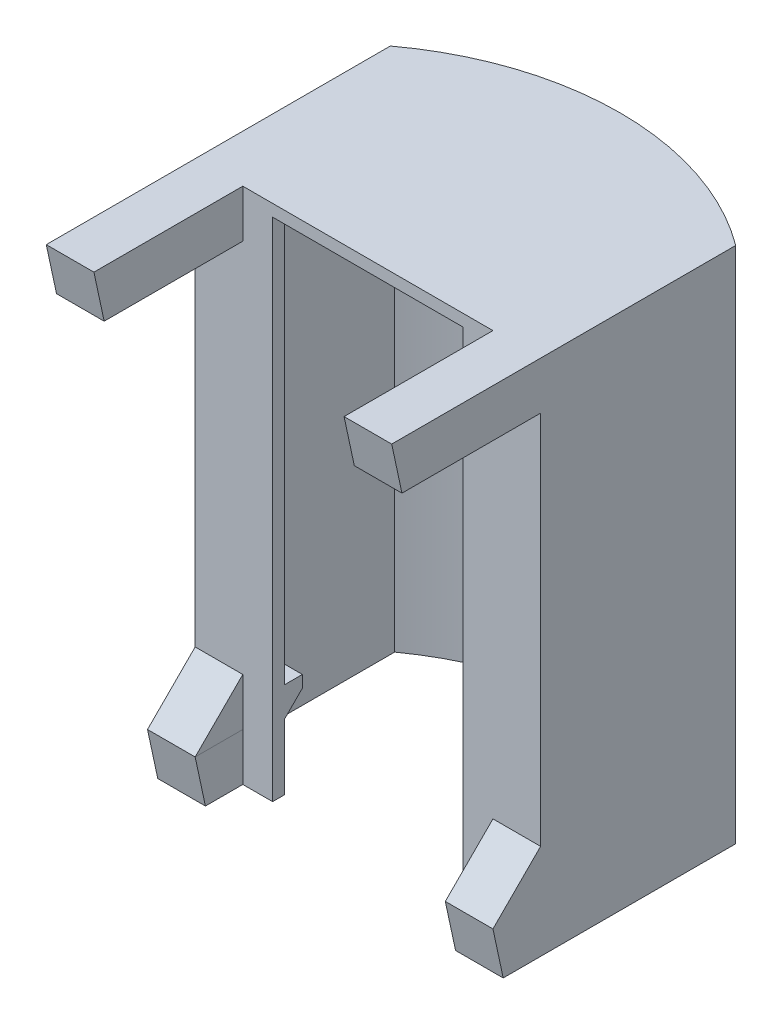
ISO-10303-21;
HEADER;
FILE_DESCRIPTION(('STEP AP214'),'2;1');
FILE_NAME('part.step','',(''),(''),'','','');
FILE_SCHEMA(('AUTOMOTIVE_DESIGN { 1 0 10303 214 1 1 1 1 }'));
ENDSEC;
DATA;
#1=APPLICATION_CONTEXT('core data for automotive mechanical design processes');
#2=APPLICATION_PROTOCOL_DEFINITION('international standard','automotive_design',2000,#1);
#3=PRODUCT_CONTEXT('',#1,'mechanical');
#4=PRODUCT('Part','Part','',(#3));
#5=PRODUCT_RELATED_PRODUCT_CATEGORY('part','',(#4));
#6=PRODUCT_DEFINITION_FORMATION('','',#4);
#7=PRODUCT_DEFINITION_CONTEXT('part definition',#1,'design');
#8=PRODUCT_DEFINITION('design','',#6,#7);
#9=PRODUCT_DEFINITION_SHAPE('','',#8);
#10=(LENGTH_UNIT() NAMED_UNIT(*) SI_UNIT(.MILLI.,.METRE.));
#11=(NAMED_UNIT(*) PLANE_ANGLE_UNIT() SI_UNIT($,.RADIAN.));
#12=(NAMED_UNIT(*) SI_UNIT($,.STERADIAN.) SOLID_ANGLE_UNIT());
#13=UNCERTAINTY_MEASURE_WITH_UNIT(LENGTH_MEASURE(1.E-05),#10,'distance_accuracy_value','');
#14=(GEOMETRIC_REPRESENTATION_CONTEXT(3) GLOBAL_UNCERTAINTY_ASSIGNED_CONTEXT((#13)) GLOBAL_UNIT_ASSIGNED_CONTEXT((#10,
#11,#12)) REPRESENTATION_CONTEXT('',''));
#15=CARTESIAN_POINT('',(0.,0.,0.));
#16=DIRECTION('',(0.,0.,1.));
#17=DIRECTION('',(1.,0.,0.));
#18=AXIS2_PLACEMENT_3D('',#15,#16,#17);
#19=CARTESIAN_POINT('',(-21.,7.99999999999999,17.));
#20=DIRECTION('',(0.,-1.,0.));
#21=DIRECTION('',(0.,0.,-1.));
#22=AXIS2_PLACEMENT_3D('',#19,#20,#21);
#23=PLANE('',#22);
#24=DIRECTION('',(0.,0.,1.));
#25=VECTOR('',#24,1.);
#26=CARTESIAN_POINT('',(-29.,7.99999999999999,17.));
#27=LINE('',#26,#25);
#28=CARTESIAN_POINT('',(-29.,7.99999999999999,17.));
#29=VERTEX_POINT('',#28);
#30=CARTESIAN_POINT('',(-29.,8.,25.));
#31=VERTEX_POINT('',#30);
#32=EDGE_CURVE('E95',#29,#31,#27,.T.);
#33=ORIENTED_EDGE('',*,*,#32,.F.);
#34=DIRECTION('',(-1.,0.,0.));
#35=VECTOR('',#34,1.);
#36=CARTESIAN_POINT('',(-21.,7.99999999999999,17.));
#37=LINE('',#36,#35);
#38=CARTESIAN_POINT('',(-21.,7.99999999999999,17.));
#39=VERTEX_POINT('',#38);
#40=EDGE_CURVE('E12',#39,#29,#37,.T.);
#41=ORIENTED_EDGE('',*,*,#40,.F.);
#42=DIRECTION('',(0.,0.,1.));
#43=VECTOR('',#42,1.);
#44=CARTESIAN_POINT('',(-21.,7.99999999999999,17.));
#45=LINE('',#44,#43);
#46=CARTESIAN_POINT('',(-21.,8.,25.));
#47=VERTEX_POINT('',#46);
#48=EDGE_CURVE('E87',#39,#47,#45,.T.);
#49=ORIENTED_EDGE('',*,*,#48,.T.);
#50=DIRECTION('',(-1.,0.,0.));
#51=VECTOR('',#50,1.);
#52=CARTESIAN_POINT('',(-21.,8.,25.));
#53=LINE('',#52,#51);
#54=EDGE_CURVE('E46',#47,#31,#53,.T.);
#55=ORIENTED_EDGE('',*,*,#54,.T.);
#56=EDGE_LOOP('',(#33,#41,#49,#55));
#57=FACE_BOUND('',#56,.T.);
#58=ADVANCED_FACE('F43',(#57),#23,.T.);
#59=CARTESIAN_POINT('',(-21.,16.0000000000001,17.));
#60=DIRECTION('',(0.,0.,-1.));
#61=DIRECTION('',(-1.,0.,0.));
#62=AXIS2_PLACEMENT_3D('',#59,#60,#61);
#63=PLANE('',#62);
#64=DIRECTION('',(0.,-1.,0.));
#65=VECTOR('',#64,1.);
#66=CARTESIAN_POINT('',(-29.,16.0000000000001,17.));
#67=LINE('',#66,#65);
#68=CARTESIAN_POINT('',(-29.,16.0000000000001,17.));
#69=VERTEX_POINT('',#68);
#70=EDGE_CURVE('E89',#69,#29,#67,.T.);
#71=ORIENTED_EDGE('',*,*,#70,.F.);
#72=DIRECTION('',(-1.,0.,0.));
#73=VECTOR('',#72,1.);
#74=CARTESIAN_POINT('',(-21.,16.0000000000001,17.));
#75=LINE('',#74,#73);
#76=CARTESIAN_POINT('',(-21.,16.0000000000001,17.));
#77=VERTEX_POINT('',#76);
#78=EDGE_CURVE('E52',#77,#69,#75,.T.);
#79=ORIENTED_EDGE('',*,*,#78,.F.);
#80=DIRECTION('',(0.,-1.,0.));
#81=VECTOR('',#80,1.);
#82=CARTESIAN_POINT('',(-21.,16.0000000000001,17.));
#83=LINE('',#82,#81);
#84=EDGE_CURVE('E84',#77,#39,#83,.T.);
#85=ORIENTED_EDGE('',*,*,#84,.T.);
#86=ORIENTED_EDGE('',*,*,#40,.T.);
#87=EDGE_LOOP('',(#71,#79,#85,#86));
#88=FACE_BOUND('',#87,.T.);
#89=ADVANCED_FACE('F99',(#88),#63,.T.);
#90=CARTESIAN_POINT('',(-21.,8.,25.));
#91=DIRECTION('',(0.,0.707106781186543,0.707106781186552));
#92=DIRECTION('',(0.,-0.707106781186552,0.707106781186543));
#93=AXIS2_PLACEMENT_3D('',#90,#91,#92);
#94=PLANE('',#93);
#95=DIRECTION('',(0.,0.707106781186552,-0.707106781186543));
#96=VECTOR('',#95,1.);
#97=CARTESIAN_POINT('',(-29.,8.,25.));
#98=LINE('',#97,#96);
#99=EDGE_CURVE('E82',#31,#69,#98,.T.);
#100=ORIENTED_EDGE('',*,*,#99,.F.);
#101=ORIENTED_EDGE('',*,*,#54,.F.);
#102=DIRECTION('',(0.,0.707106781186552,-0.707106781186543));
#103=VECTOR('',#102,1.);
#104=CARTESIAN_POINT('',(-21.,8.,25.));
#105=LINE('',#104,#103);
#106=EDGE_CURVE('E80',#47,#77,#105,.T.);
#107=ORIENTED_EDGE('',*,*,#106,.T.);
#108=ORIENTED_EDGE('',*,*,#78,.T.);
#109=EDGE_LOOP('',(#100,#101,#107,#108));
#110=FACE_BOUND('',#109,.T.);
#111=ADVANCED_FACE('F79',(#110),#94,.T.);
#112=CARTESIAN_POINT('',(-21.,0.,0.));
#113=DIRECTION('',(1.,0.,0.));
#114=DIRECTION('',(0.,0.,-1.));
#115=AXIS2_PLACEMENT_3D('',#112,#113,#114);
#116=PLANE('',#115);
#117=ORIENTED_EDGE('',*,*,#48,.F.);
#118=ORIENTED_EDGE('',*,*,#84,.F.);
#119=ORIENTED_EDGE('',*,*,#106,.F.);
#120=EDGE_LOOP('',(#117,#118,#119));
#121=FACE_BOUND('',#120,.T.);
#122=ADVANCED_FACE('F86',(#121),#116,.T.);
#123=CARTESIAN_POINT('',(-29.,0.,0.));
#124=DIRECTION('',(1.,0.,0.));
#125=DIRECTION('',(0.,0.,-1.));
#126=AXIS2_PLACEMENT_3D('',#123,#124,#125);
#127=PLANE('',#126);
#128=ORIENTED_EDGE('',*,*,#32,.T.);
#129=ORIENTED_EDGE('',*,*,#99,.T.);
#130=ORIENTED_EDGE('',*,*,#70,.T.);
#131=EDGE_LOOP('',(#128,#129,#130));
#132=FACE_BOUND('',#131,.T.);
#133=ADVANCED_FACE('F98',(#132),#127,.F.);
#134=CLOSED_SHELL('',(#58,#89,#111,#122,#133));
#135=MANIFOLD_SOLID_BREP('B2',#134);
#136=CARTESIAN_POINT('',(-27.5,85.,15.));
#137=DIRECTION('',(0.,0.,1.));
#138=DIRECTION('',(1.,0.,0.));
#139=AXIS2_PLACEMENT_3D('',#136,#137,#138);
#140=PLANE('',#139);
#141=DIRECTION('',(1.,0.,0.));
#142=VECTOR('',#141,1.);
#143=CARTESIAN_POINT('',(-27.5,16.,15.));
#144=LINE('',#143,#142);
#145=CARTESIAN_POINT('',(-27.5,16.,15.));
#146=VERTEX_POINT('',#145);
#147=CARTESIAN_POINT('',(-16.,16.,15.));
#148=VERTEX_POINT('',#147);
#149=EDGE_CURVE('E367',#146,#148,#144,.T.);
#150=ORIENTED_EDGE('',*,*,#149,.F.);
#151=DIRECTION('',(0.,-1.,0.));
#152=VECTOR('',#151,1.);
#153=CARTESIAN_POINT('',(-27.5,85.,15.));
#154=LINE('',#153,#152);
#155=CARTESIAN_POINT('',(-27.5,85.,15.));
#156=VERTEX_POINT('',#155);
#157=EDGE_CURVE('E372',#156,#146,#154,.T.);
#158=ORIENTED_EDGE('',*,*,#157,.F.);
#159=DIRECTION('',(-1.,0.,0.));
#160=VECTOR('',#159,1.);
#161=CARTESIAN_POINT('',(-27.5,85.,15.));
#162=LINE('',#161,#160);
#163=CARTESIAN_POINT('',(-16.,85.,15.));
#164=VERTEX_POINT('',#163);
#165=EDGE_CURVE('E515',#164,#156,#162,.T.);
#166=ORIENTED_EDGE('',*,*,#165,.F.);
#167=DIRECTION('',(0.,-1.,0.));
#168=VECTOR('',#167,1.);
#169=CARTESIAN_POINT('',(-16.,85.,15.));
#170=LINE('',#169,#168);
#171=EDGE_CURVE('E558',#164,#148,#170,.T.);
#172=ORIENTED_EDGE('',*,*,#171,.T.);
#173=EDGE_LOOP('',(#150,#158,#166,#172));
#174=FACE_BOUND('',#173,.T.);
#175=ADVANCED_FACE('F141',(#174),#140,.F.);
#176=CARTESIAN_POINT('',(-27.5,11.,15.));
#177=VERTEX_POINT('',#176);
#178=CARTESIAN_POINT('',(-27.5,0.,15.));
#179=VERTEX_POINT('',#178);
#180=EDGE_CURVE('E555',#177,#179,#154,.T.);
#181=ORIENTED_EDGE('',*,*,#180,.F.);
#182=DIRECTION('',(1.,0.,0.));
#183=VECTOR('',#182,1.);
#184=CARTESIAN_POINT('',(-16.,11.,15.));
#185=LINE('',#184,#183);
#186=CARTESIAN_POINT('',(-16.,11.,15.));
#187=VERTEX_POINT('',#186);
#188=EDGE_CURVE('E591',#177,#187,#185,.T.);
#189=ORIENTED_EDGE('',*,*,#188,.T.);
#190=CARTESIAN_POINT('',(-16.,0.,15.));
#191=VERTEX_POINT('',#190);
#192=EDGE_CURVE('E557',#187,#191,#170,.T.);
#193=ORIENTED_EDGE('',*,*,#192,.T.);
#194=DIRECTION('',(-1.,0.,0.));
#195=VECTOR('',#194,1.);
#196=CARTESIAN_POINT('',(-27.5,0.,15.));
#197=LINE('',#196,#195);
#198=EDGE_CURVE('E549',#191,#179,#197,.T.);
#199=ORIENTED_EDGE('',*,*,#198,.T.);
#200=EDGE_LOOP('',(#181,#189,#193,#199));
#201=FACE_BOUND('',#200,.T.);
#202=ADVANCED_FACE('F623',(#201),#140,.F.);
#203=CARTESIAN_POINT('',(-27.5,85.,15.));
#204=DIRECTION('',(-1.,0.,0.));
#205=DIRECTION('',(0.,0.,1.));
#206=AXIS2_PLACEMENT_3D('',#203,#204,#205);
#207=PLANE('',#206);
#208=DIRECTION('',(0.,1.,0.));
#209=VECTOR('',#208,1.);
#210=CARTESIAN_POINT('',(-27.5,14.,12.));
#211=LINE('',#210,#209);
#212=CARTESIAN_POINT('',(-27.5,14.,12.));
#213=VERTEX_POINT('',#212);
#214=CARTESIAN_POINT('',(-27.5,16.,12.));
#215=VERTEX_POINT('',#214);
#216=EDGE_CURVE('E359',#213,#215,#211,.T.);
#217=ORIENTED_EDGE('',*,*,#216,.F.);
#218=DIRECTION('',(0.,0.707106781186544,-0.707106781186551));
#219=VECTOR('',#218,1.);
#220=CARTESIAN_POINT('',(-27.5,14.,12.));
#221=LINE('',#220,#219);
#222=EDGE_CURVE('E589',#213,#177,#221,.F.);
#223=ORIENTED_EDGE('',*,*,#222,.T.);
#224=ORIENTED_EDGE('',*,*,#180,.T.);
#225=DIRECTION('',(0.,0.,-1.));
#226=VECTOR('',#225,1.);
#227=CARTESIAN_POINT('',(-27.5,0.,15.));
#228=LINE('',#227,#226);
#229=CARTESIAN_POINT('',(-27.5,0.,-15.));
#230=VERTEX_POINT('',#229);
#231=EDGE_CURVE('E503',#179,#230,#228,.T.);
#232=ORIENTED_EDGE('',*,*,#231,.T.);
#233=DIRECTION('',(0.,-1.,0.));
#234=VECTOR('',#233,1.);
#235=CARTESIAN_POINT('',(-27.5,85.,-15.));
#236=LINE('',#235,#234);
#237=CARTESIAN_POINT('',(-27.5,85.,-15.));
#238=VERTEX_POINT('',#237);
#239=EDGE_CURVE('E521',#238,#230,#236,.T.);
#240=ORIENTED_EDGE('',*,*,#239,.F.);
#241=DIRECTION('',(0.,0.,-1.));
#242=VECTOR('',#241,1.);
#243=CARTESIAN_POINT('',(-27.5,85.,15.));
#244=LINE('',#243,#242);
#245=EDGE_CURVE('E518',#156,#238,#244,.T.);
#246=ORIENTED_EDGE('',*,*,#245,.F.);
#247=ORIENTED_EDGE('',*,*,#157,.T.);
#248=DIRECTION('',(0.,0.,1.));
#249=VECTOR('',#248,1.);
#250=CARTESIAN_POINT('',(-27.5,16.,12.));
#251=LINE('',#250,#249);
#252=EDGE_CURVE('E351',#215,#146,#251,.T.);
#253=ORIENTED_EDGE('',*,*,#252,.F.);
#254=EDGE_LOOP('',(#217,#223,#224,#232,#240,#246,#247,#253));
#255=FACE_BOUND('',#254,.T.);
#256=ADVANCED_FACE('F370',(#255),#207,.F.);
#257=CARTESIAN_POINT('',(27.5,85.,15.));
#258=DIRECTION('',(1.,0.,0.));
#259=DIRECTION('',(0.,0.,-1.));
#260=AXIS2_PLACEMENT_3D('',#257,#258,#259);
#261=PLANE('',#260);
#262=DIRECTION('',(0.,-1.,0.));
#263=VECTOR('',#262,1.);
#264=CARTESIAN_POINT('',(27.5,85.,15.));
#265=LINE('',#264,#263);
#266=CARTESIAN_POINT('',(27.5,11.,15.));
#267=VERTEX_POINT('',#266);
#268=CARTESIAN_POINT('',(27.5,0.,15.));
#269=VERTEX_POINT('',#268);
#270=EDGE_CURVE('E582',#267,#269,#265,.T.);
#271=ORIENTED_EDGE('',*,*,#270,.F.);
#272=DIRECTION('',(0.,-0.707106781186545,0.707106781186551));
#273=VECTOR('',#272,1.);
#274=CARTESIAN_POINT('',(27.5,14.,12.));
#275=LINE('',#274,#273);
#276=CARTESIAN_POINT('',(27.5,14.,12.));
#277=VERTEX_POINT('',#276);
#278=EDGE_CURVE('E594',#267,#277,#275,.F.);
#279=ORIENTED_EDGE('',*,*,#278,.T.);
#280=DIRECTION('',(0.,-1.,0.));
#281=VECTOR('',#280,1.);
#282=CARTESIAN_POINT('',(27.5,14.,12.));
#283=LINE('',#282,#281);
#284=CARTESIAN_POINT('',(27.5,16.,12.));
#285=VERTEX_POINT('',#284);
#286=EDGE_CURVE('E375',#285,#277,#283,.T.);
#287=ORIENTED_EDGE('',*,*,#286,.F.);
#288=DIRECTION('',(0.,0.,1.));
#289=VECTOR('',#288,1.);
#290=CARTESIAN_POINT('',(27.5,16.,12.));
#291=LINE('',#290,#289);
#292=CARTESIAN_POINT('',(27.5,16.,15.));
#293=VERTEX_POINT('',#292);
#294=EDGE_CURVE('E388',#285,#293,#291,.T.);
#295=ORIENTED_EDGE('',*,*,#294,.T.);
#296=CARTESIAN_POINT('',(27.5,85.,15.));
#297=VERTEX_POINT('',#296);
#298=EDGE_CURVE('E583',#297,#293,#265,.T.);
#299=ORIENTED_EDGE('',*,*,#298,.F.);
#300=DIRECTION('',(0.,0.,1.));
#301=VECTOR('',#300,1.);
#302=CARTESIAN_POINT('',(27.5,85.,15.));
#303=LINE('',#302,#301);
#304=CARTESIAN_POINT('',(27.5,85.,-15.));
#305=VERTEX_POINT('',#304);
#306=EDGE_CURVE('E502',#305,#297,#303,.T.);
#307=ORIENTED_EDGE('',*,*,#306,.F.);
#308=DIRECTION('',(0.,-1.,0.));
#309=VECTOR('',#308,1.);
#310=CARTESIAN_POINT('',(27.5,85.,-15.));
#311=LINE('',#310,#309);
#312=CARTESIAN_POINT('',(27.5,0.,-15.));
#313=VERTEX_POINT('',#312);
#314=EDGE_CURVE('E586',#305,#313,#311,.T.);
#315=ORIENTED_EDGE('',*,*,#314,.T.);
#316=DIRECTION('',(0.,0.,1.));
#317=VECTOR('',#316,1.);
#318=CARTESIAN_POINT('',(27.5,0.,15.));
#319=LINE('',#318,#317);
#320=EDGE_CURVE('E524',#313,#269,#319,.T.);
#321=ORIENTED_EDGE('',*,*,#320,.T.);
#322=EDGE_LOOP('',(#271,#279,#287,#295,#299,#307,#315,#321));
#323=FACE_BOUND('',#322,.T.);
#324=ADVANCED_FACE('F631',(#323),#261,.F.);
#325=CARTESIAN_POINT('',(16.,85.,15.));
#326=DIRECTION('',(0.,0.,1.));
#327=DIRECTION('',(1.,0.,0.));
#328=AXIS2_PLACEMENT_3D('',#325,#326,#327);
#329=PLANE('',#328);
#330=DIRECTION('',(0.,-1.,0.));
#331=VECTOR('',#330,1.);
#332=CARTESIAN_POINT('',(16.,85.,15.));
#333=LINE('',#332,#331);
#334=CARTESIAN_POINT('',(16.,11.,15.));
#335=VERTEX_POINT('',#334);
#336=CARTESIAN_POINT('',(16.,0.,15.));
#337=VERTEX_POINT('',#336);
#338=EDGE_CURVE('E578',#335,#337,#333,.T.);
#339=ORIENTED_EDGE('',*,*,#338,.F.);
#340=DIRECTION('',(1.,0.,0.));
#341=VECTOR('',#340,1.);
#342=CARTESIAN_POINT('',(27.5,11.,15.));
#343=LINE('',#342,#341);
#344=EDGE_CURVE('E161',#335,#267,#343,.T.);
#345=ORIENTED_EDGE('',*,*,#344,.T.);
#346=ORIENTED_EDGE('',*,*,#270,.T.);
#347=DIRECTION('',(-1.,0.,0.));
#348=VECTOR('',#347,1.);
#349=CARTESIAN_POINT('',(16.,0.,15.));
#350=LINE('',#349,#348);
#351=EDGE_CURVE('E527',#269,#337,#350,.T.);
#352=ORIENTED_EDGE('',*,*,#351,.T.);
#353=EDGE_LOOP('',(#339,#345,#346,#352));
#354=FACE_BOUND('',#353,.T.);
#355=ADVANCED_FACE('F728',(#354),#329,.F.);
#356=DIRECTION('',(1.,0.,0.));
#357=VECTOR('',#356,1.);
#358=CARTESIAN_POINT('',(27.5,16.,15.));
#359=LINE('',#358,#357);
#360=CARTESIAN_POINT('',(16.,16.,15.));
#361=VERTEX_POINT('',#360);
#362=EDGE_CURVE('E373',#361,#293,#359,.T.);
#363=ORIENTED_EDGE('',*,*,#362,.F.);
#364=CARTESIAN_POINT('',(16.,85.,15.));
#365=VERTEX_POINT('',#364);
#366=EDGE_CURVE('E579',#365,#361,#333,.T.);
#367=ORIENTED_EDGE('',*,*,#366,.F.);
#368=DIRECTION('',(-1.,0.,0.));
#369=VECTOR('',#368,1.);
#370=CARTESIAN_POINT('',(16.,85.,15.));
#371=LINE('',#370,#369);
#372=EDGE_CURVE('E506',#297,#365,#371,.T.);
#373=ORIENTED_EDGE('',*,*,#372,.F.);
#374=ORIENTED_EDGE('',*,*,#298,.T.);
#375=EDGE_LOOP('',(#363,#367,#373,#374));
#376=FACE_BOUND('',#375,.T.);
#377=ADVANCED_FACE('F636',(#376),#329,.F.);
#378=CARTESIAN_POINT('',(-27.5,85.,17.));
#379=DIRECTION('',(0.,0.,-1.));
#380=DIRECTION('',(-1.,0.,0.));
#381=AXIS2_PLACEMENT_3D('',#378,#379,#380);
#382=PLANE('',#381);
#383=DIRECTION('',(0.,-1.,0.));
#384=VECTOR('',#383,1.);
#385=CARTESIAN_POINT('',(21.,0.,17.));
#386=LINE('',#385,#384);
#387=CARTESIAN_POINT('',(21.,15.9999999999999,17.));
#388=VERTEX_POINT('',#387);
#389=CARTESIAN_POINT('',(21.,0.,17.));
#390=VERTEX_POINT('',#389);
#391=EDGE_CURVE('E430',#388,#390,#386,.T.);
#392=ORIENTED_EDGE('',*,*,#391,.F.);
#393=DIRECTION('',(1.,0.,0.));
#394=VECTOR('',#393,1.);
#395=CARTESIAN_POINT('',(21.,15.9999999999999,17.));
#396=LINE('',#395,#394);
#397=CARTESIAN_POINT('',(29.,15.9999999999999,17.));
#398=VERTEX_POINT('',#397);
#399=EDGE_CURVE('E397',#388,#398,#396,.T.);
#400=ORIENTED_EDGE('',*,*,#399,.T.);
#401=DIRECTION('',(0.,-1.,0.));
#402=VECTOR('',#401,1.);
#403=CARTESIAN_POINT('',(29.,85.,17.));
#404=LINE('',#403,#402);
#405=CARTESIAN_POINT('',(29.,79.,17.));
#406=VERTEX_POINT('',#405);
#407=EDGE_CURVE('E572',#406,#398,#404,.T.);
#408=ORIENTED_EDGE('',*,*,#407,.F.);
#409=DIRECTION('',(1.,0.,0.));
#410=VECTOR('',#409,1.);
#411=CARTESIAN_POINT('',(29.,79.,17.));
#412=LINE('',#411,#410);
#413=CARTESIAN_POINT('',(21.,79.,17.));
#414=VERTEX_POINT('',#413);
#415=EDGE_CURVE('E458',#414,#406,#412,.T.);
#416=ORIENTED_EDGE('',*,*,#415,.F.);
#417=DIRECTION('',(0.,-1.,0.));
#418=VECTOR('',#417,1.);
#419=CARTESIAN_POINT('',(21.,87.,17.));
#420=LINE('',#419,#418);
#421=CARTESIAN_POINT('',(21.,87.,17.));
#422=VERTEX_POINT('',#421);
#423=EDGE_CURVE('E454',#422,#414,#420,.T.);
#424=ORIENTED_EDGE('',*,*,#423,.F.);
#425=DIRECTION('',(1.,0.,0.));
#426=VECTOR('',#425,1.);
#427=CARTESIAN_POINT('',(16.,87.,17.));
#428=LINE('',#427,#426);
#429=CARTESIAN_POINT('',(-21.,87.,17.));
#430=VERTEX_POINT('',#429);
#431=EDGE_CURVE('E484',#430,#422,#428,.T.);
#432=ORIENTED_EDGE('',*,*,#431,.F.);
#433=DIRECTION('',(0.,1.,0.));
#434=VECTOR('',#433,1.);
#435=CARTESIAN_POINT('',(-21.,87.,17.));
#436=LINE('',#435,#434);
#437=CARTESIAN_POINT('',(-21.,79.,17.));
#438=VERTEX_POINT('',#437);
#439=EDGE_CURVE('E472',#438,#430,#436,.T.);
#440=ORIENTED_EDGE('',*,*,#439,.F.);
#441=DIRECTION('',(1.,0.,0.));
#442=VECTOR('',#441,1.);
#443=CARTESIAN_POINT('',(-29.,79.,17.));
#444=LINE('',#443,#442);
#445=CARTESIAN_POINT('',(-29.,79.,17.));
#446=VERTEX_POINT('',#445);
#447=EDGE_CURVE('E468',#446,#438,#444,.T.);
#448=ORIENTED_EDGE('',*,*,#447,.F.);
#449=DIRECTION('',(0.,-1.,0.));
#450=VECTOR('',#449,1.);
#451=CARTESIAN_POINT('',(-29.,85.,17.));
#452=LINE('',#451,#450);
#453=CARTESIAN_POINT('',(-29.,7.99999999999999,17.));
#454=VERTEX_POINT('',#453);
#455=EDGE_CURVE('E564',#446,#454,#452,.T.);
#456=ORIENTED_EDGE('',*,*,#455,.T.);
#457=DIRECTION('',(-1.,0.,0.));
#458=VECTOR('',#457,1.);
#459=CARTESIAN_POINT('',(-29.,8.,17.));
#460=LINE('',#459,#458);
#461=CARTESIAN_POINT('',(-21.,7.99999999999999,17.));
#462=VERTEX_POINT('',#461);
#463=EDGE_CURVE('E442',#462,#454,#460,.T.);
#464=ORIENTED_EDGE('',*,*,#463,.F.);
#465=DIRECTION('',(0.,1.,0.));
#466=VECTOR('',#465,1.);
#467=CARTESIAN_POINT('',(-21.,0.,17.));
#468=LINE('',#467,#466);
#469=CARTESIAN_POINT('',(-21.,0.,17.));
#470=VERTEX_POINT('',#469);
#471=EDGE_CURVE('E438',#470,#462,#468,.T.);
#472=ORIENTED_EDGE('',*,*,#471,.F.);
#473=DIRECTION('',(1.,0.,0.));
#474=VECTOR('',#473,1.);
#475=CARTESIAN_POINT('',(-27.5,0.,17.));
#476=LINE('',#475,#474);
#477=CARTESIAN_POINT('',(-16.,0.,17.));
#478=VERTEX_POINT('',#477);
#479=EDGE_CURVE('E544',#470,#478,#476,.T.);
#480=ORIENTED_EDGE('',*,*,#479,.T.);
#481=DIRECTION('',(0.,-1.,0.));
#482=VECTOR('',#481,1.);
#483=CARTESIAN_POINT('',(-16.,85.,17.));
#484=LINE('',#483,#482);
#485=CARTESIAN_POINT('',(-16.,85.,17.));
#486=VERTEX_POINT('',#485);
#487=EDGE_CURVE('E561',#486,#478,#484,.T.);
#488=ORIENTED_EDGE('',*,*,#487,.F.);
#489=DIRECTION('',(1.,0.,0.));
#490=VECTOR('',#489,1.);
#491=CARTESIAN_POINT('',(-16.,85.,17.));
#492=LINE('',#491,#490);
#493=CARTESIAN_POINT('',(16.,85.,17.));
#494=VERTEX_POINT('',#493);
#495=EDGE_CURVE('E483',#486,#494,#492,.T.);
#496=ORIENTED_EDGE('',*,*,#495,.T.);
#497=DIRECTION('',(0.,-1.,0.));
#498=VECTOR('',#497,1.);
#499=CARTESIAN_POINT('',(16.,85.,17.));
#500=LINE('',#499,#498);
#501=CARTESIAN_POINT('',(16.,0.,17.));
#502=VERTEX_POINT('',#501);
#503=EDGE_CURVE('E575',#494,#502,#500,.T.);
#504=ORIENTED_EDGE('',*,*,#503,.T.);
#505=DIRECTION('',(1.,0.,0.));
#506=VECTOR('',#505,1.);
#507=CARTESIAN_POINT('',(27.5,0.,17.));
#508=LINE('',#507,#506);
#509=EDGE_CURVE('E533',#502,#390,#508,.T.);
#510=ORIENTED_EDGE('',*,*,#509,.T.);
#511=EDGE_LOOP('',(#392,#400,#408,#416,#424,#432,#440,#448,#456,#464,#472,#480,#488,#496,#504,#510));
#512=FACE_BOUND('',#511,.T.);
#513=ADVANCED_FACE('F639',(#512),#382,.F.);
#514=CARTESIAN_POINT('',(0.,85.,23.3475438007224));
#515=DIRECTION('',(0.,-1.,0.));
#516=DIRECTION('',(0.,0.,-1.));
#517=AXIS2_PLACEMENT_3D('',#514,#515,#516);
#518=CYLINDRICAL_SURFACE('',#517,47.1888134577288);
#519=CARTESIAN_POINT('',(0.,0.,23.3475438007224));
#520=DIRECTION('',(0.,-1.,0.));
#521=DIRECTION('',(0.,0.,-1.));
#522=AXIS2_PLACEMENT_3D('',#519,#520,#521);
#523=CIRCLE('',#522,47.1888134577288);
#524=EDGE_CURVE('E496',#230,#313,#523,.T.);
#525=ORIENTED_EDGE('',*,*,#524,.T.);
#526=ORIENTED_EDGE('',*,*,#314,.F.);
#527=CARTESIAN_POINT('',(0.,85.,23.3475438007224));
#528=DIRECTION('',(0.,-1.,0.));
#529=DIRECTION('',(0.,0.,-1.));
#530=AXIS2_PLACEMENT_3D('',#527,#528,#529);
#531=CIRCLE('',#530,47.1888134577288);
#532=EDGE_CURVE('E499',#238,#305,#531,.T.);
#533=ORIENTED_EDGE('',*,*,#532,.F.);
#534=ORIENTED_EDGE('',*,*,#239,.T.);
#535=EDGE_LOOP('',(#525,#526,#533,#534));
#536=FACE_BOUND('',#535,.T.);
#537=ADVANCED_FACE('F626',(#536),#518,.F.);
#538=CARTESIAN_POINT('',(16.,85.,15.));
#539=DIRECTION('',(1.,0.,0.));
#540=DIRECTION('',(0.,0.,-1.));
#541=AXIS2_PLACEMENT_3D('',#538,#539,#540);
#542=PLANE('',#541);
#543=DIRECTION('',(0.,0.,1.));
#544=VECTOR('',#543,1.);
#545=CARTESIAN_POINT('',(16.,0.,15.));
#546=LINE('',#545,#544);
#547=EDGE_CURVE('E530',#337,#502,#546,.T.);
#548=ORIENTED_EDGE('',*,*,#547,.T.);
#549=ORIENTED_EDGE('',*,*,#503,.F.);
#550=DIRECTION('',(0.,0.,1.));
#551=VECTOR('',#550,1.);
#552=CARTESIAN_POINT('',(16.,85.,15.));
#553=LINE('',#552,#551);
#554=EDGE_CURVE('E509',#365,#494,#553,.T.);
#555=ORIENTED_EDGE('',*,*,#554,.F.);
#556=ORIENTED_EDGE('',*,*,#366,.T.);
#557=DIRECTION('',(0.,0.,1.));
#558=VECTOR('',#557,1.);
#559=CARTESIAN_POINT('',(16.,16.,12.));
#560=LINE('',#559,#558);
#561=CARTESIAN_POINT('',(16.,16.,12.));
#562=VERTEX_POINT('',#561);
#563=EDGE_CURVE('E392',#562,#361,#560,.T.);
#564=ORIENTED_EDGE('',*,*,#563,.F.);
#565=DIRECTION('',(0.,1.,0.));
#566=VECTOR('',#565,1.);
#567=CARTESIAN_POINT('',(16.,14.,12.));
#568=LINE('',#567,#566);
#569=CARTESIAN_POINT('',(16.,14.,12.));
#570=VERTEX_POINT('',#569);
#571=EDGE_CURVE('E385',#570,#562,#568,.T.);
#572=ORIENTED_EDGE('',*,*,#571,.F.);
#573=DIRECTION('',(0.,0.707106781186545,-0.707106781186551));
#574=VECTOR('',#573,1.);
#575=CARTESIAN_POINT('',(16.,47.9999999999997,-22.));
#576=LINE('',#575,#574);
#577=EDGE_CURVE('E41',#570,#335,#576,.F.);
#578=ORIENTED_EDGE('',*,*,#577,.T.);
#579=ORIENTED_EDGE('',*,*,#338,.T.);
#580=EDGE_LOOP('',(#548,#549,#555,#556,#564,#572,#578,#579));
#581=FACE_BOUND('',#580,.T.);
#582=ADVANCED_FACE('F638',(#581),#542,.F.);
#583=CARTESIAN_POINT('',(29.,85.,15.));
#584=DIRECTION('',(-1.,0.,0.));
#585=DIRECTION('',(0.,0.,1.));
#586=AXIS2_PLACEMENT_3D('',#583,#584,#585);
#587=PLANE('',#586);
#588=ORIENTED_EDGE('',*,*,#407,.T.);
#589=DIRECTION('',(0.,-0.707106781186544,0.707106781186551));
#590=VECTOR('',#589,1.);
#591=CARTESIAN_POINT('',(29.,8.,25.));
#592=LINE('',#591,#590);
#593=CARTESIAN_POINT('',(29.,8.,25.));
#594=VERTEX_POINT('',#593);
#595=EDGE_CURVE('E394',#398,#594,#592,.T.);
#596=ORIENTED_EDGE('',*,*,#595,.T.);
#597=DIRECTION('',(0.,0.977620952046626,0.210374128921426));
#598=VECTOR('',#597,1.);
#599=CARTESIAN_POINT('',(29.,87.,42.));
#600=LINE('',#599,#598);
#601=CARTESIAN_POINT('',(29.,0.,23.2784810126582));
#602=VERTEX_POINT('',#601);
#603=EDGE_CURVE('E407',#602,#594,#600,.T.);
#604=ORIENTED_EDGE('',*,*,#603,.F.);
#605=DIRECTION('',(0.,0.,-1.));
#606=VECTOR('',#605,1.);
#607=CARTESIAN_POINT('',(29.,0.,15.));
#608=LINE('',#607,#606);
#609=CARTESIAN_POINT('',(29.,0.,-15.7625643034686));
#610=VERTEX_POINT('',#609);
#611=EDGE_CURVE('E536',#602,#610,#608,.T.);
#612=ORIENTED_EDGE('',*,*,#611,.T.);
#613=DIRECTION('',(0.,-1.,0.));
#614=VECTOR('',#613,1.);
#615=CARTESIAN_POINT('',(29.,85.,-15.7625643034686));
#616=LINE('',#615,#614);
#617=CARTESIAN_POINT('',(29.,87.,-15.7625643034686));
#618=VERTEX_POINT('',#617);
#619=EDGE_CURVE('E569',#618,#610,#616,.T.);
#620=ORIENTED_EDGE('',*,*,#619,.F.);
#621=DIRECTION('',(0.,0.,-1.));
#622=VECTOR('',#621,1.);
#623=CARTESIAN_POINT('',(29.,87.,17.));
#624=LINE('',#623,#622);
#625=CARTESIAN_POINT('',(29.,87.,42.));
#626=VERTEX_POINT('',#625);
#627=EDGE_CURVE('E487',#626,#618,#624,.T.);
#628=ORIENTED_EDGE('',*,*,#627,.F.);
#629=CARTESIAN_POINT('',(29.,79.,40.2784810126582));
#630=VERTEX_POINT('',#629);
#631=EDGE_CURVE('E402',#630,#626,#600,.T.);
#632=ORIENTED_EDGE('',*,*,#631,.F.);
#633=DIRECTION('',(0.,0.,-1.));
#634=VECTOR('',#633,1.);
#635=CARTESIAN_POINT('',(29.,79.,42.));
#636=LINE('',#635,#634);
#637=EDGE_CURVE('E457',#630,#406,#636,.T.);
#638=ORIENTED_EDGE('',*,*,#637,.T.);
#639=EDGE_LOOP('',(#588,#596,#604,#612,#620,#628,#632,#638));
#640=FACE_BOUND('',#639,.T.);
#641=ADVANCED_FACE('F654',(#640),#587,.F.);
#642=CARTESIAN_POINT('',(0.,85.,23.3475438007224));
#643=DIRECTION('',(0.,-1.,0.));
#644=DIRECTION('',(0.,0.,-1.));
#645=AXIS2_PLACEMENT_3D('',#642,#643,#644);
#646=CYLINDRICAL_SURFACE('',#645,48.6888134577288);
#647=CARTESIAN_POINT('',(0.,0.,23.3475438007224));
#648=DIRECTION('',(0.,1.,0.));
#649=DIRECTION('',(0.,0.,-1.));
#650=AXIS2_PLACEMENT_3D('',#647,#648,#649);
#651=CIRCLE('',#650,48.6888134577288);
#652=CARTESIAN_POINT('',(-29.,0.,-15.7625643034686));
#653=VERTEX_POINT('',#652);
#654=EDGE_CURVE('E538',#610,#653,#651,.T.);
#655=ORIENTED_EDGE('',*,*,#654,.T.);
#656=DIRECTION('',(0.,-1.,0.));
#657=VECTOR('',#656,1.);
#658=CARTESIAN_POINT('',(-29.,85.,-15.7625643034686));
#659=LINE('',#658,#657);
#660=CARTESIAN_POINT('',(-29.,87.,-15.7625643034686));
#661=VERTEX_POINT('',#660);
#662=EDGE_CURVE('E566',#661,#653,#659,.T.);
#663=ORIENTED_EDGE('',*,*,#662,.F.);
#664=CARTESIAN_POINT('',(0.,87.,23.3475438007224));
#665=DIRECTION('',(0.,1.,0.));
#666=DIRECTION('',(0.,0.,1.));
#667=AXIS2_PLACEMENT_3D('',#664,#665,#666);
#668=CIRCLE('',#667,48.6888134577288);
#669=EDGE_CURVE('E490',#618,#661,#668,.T.);
#670=ORIENTED_EDGE('',*,*,#669,.F.);
#671=ORIENTED_EDGE('',*,*,#619,.T.);
#672=EDGE_LOOP('',(#655,#663,#670,#671));
#673=FACE_BOUND('',#672,.T.);
#674=ADVANCED_FACE('F657',(#673),#646,.T.);
#675=CARTESIAN_POINT('',(-29.,85.,15.));
#676=DIRECTION('',(1.,0.,0.));
#677=DIRECTION('',(0.,0.,-1.));
#678=AXIS2_PLACEMENT_3D('',#675,#676,#677);
#679=PLANE('',#678);
#680=DIRECTION('',(0.,0.,1.));
#681=VECTOR('',#680,1.);
#682=CARTESIAN_POINT('',(-29.,0.,15.));
#683=LINE('',#682,#681);
#684=CARTESIAN_POINT('',(-29.,0.,23.2784810126582));
#685=VERTEX_POINT('',#684);
#686=EDGE_CURVE('E541',#653,#685,#683,.T.);
#687=ORIENTED_EDGE('',*,*,#686,.T.);
#688=DIRECTION('',(0.,0.977620952046626,0.210374128921426));
#689=VECTOR('',#688,1.);
#690=CARTESIAN_POINT('',(-29.,8.,25.));
#691=LINE('',#690,#689);
#692=CARTESIAN_POINT('',(-29.,8.,25.));
#693=VERTEX_POINT('',#692);
#694=EDGE_CURVE('E406',#685,#693,#691,.T.);
#695=ORIENTED_EDGE('',*,*,#694,.T.);
#696=DIRECTION('',(0.,0.,-1.));
#697=VECTOR('',#696,1.);
#698=CARTESIAN_POINT('',(-29.,8.,25.));
#699=LINE('',#698,#697);
#700=EDGE_CURVE('E441',#693,#454,#699,.T.);
#701=ORIENTED_EDGE('',*,*,#700,.T.);
#702=ORIENTED_EDGE('',*,*,#455,.F.);
#703=DIRECTION('',(0.,0.,-1.));
#704=VECTOR('',#703,1.);
#705=CARTESIAN_POINT('',(-29.,79.,42.));
#706=LINE('',#705,#704);
#707=CARTESIAN_POINT('',(-29.,79.,40.2784810126582));
#708=VERTEX_POINT('',#707);
#709=EDGE_CURVE('E481',#708,#446,#706,.T.);
#710=ORIENTED_EDGE('',*,*,#709,.F.);
#711=CARTESIAN_POINT('',(-29.,87.,42.));
#712=VERTEX_POINT('',#711);
#713=EDGE_CURVE('E403',#708,#712,#691,.T.);
#714=ORIENTED_EDGE('',*,*,#713,.T.);
#715=DIRECTION('',(0.,0.,1.));
#716=VECTOR('',#715,1.);
#717=CARTESIAN_POINT('',(-29.,87.,-15.7625643034686));
#718=LINE('',#717,#716);
#719=EDGE_CURVE('E493',#661,#712,#718,.T.);
#720=ORIENTED_EDGE('',*,*,#719,.F.);
#721=ORIENTED_EDGE('',*,*,#662,.T.);
#722=EDGE_LOOP('',(#687,#695,#701,#702,#710,#714,#720,#721));
#723=FACE_BOUND('',#722,.T.);
#724=ADVANCED_FACE('F661',(#723),#679,.F.);
#725=CARTESIAN_POINT('',(-16.,85.,15.));
#726=DIRECTION('',(-1.,0.,0.));
#727=DIRECTION('',(0.,0.,1.));
#728=AXIS2_PLACEMENT_3D('',#725,#726,#727);
#729=PLANE('',#728);
#730=DIRECTION('',(0.,0.,-1.));
#731=VECTOR('',#730,1.);
#732=CARTESIAN_POINT('',(-16.,0.,15.));
#733=LINE('',#732,#731);
#734=EDGE_CURVE('E546',#478,#191,#733,.T.);
#735=ORIENTED_EDGE('',*,*,#734,.T.);
#736=ORIENTED_EDGE('',*,*,#192,.F.);
#737=DIRECTION('',(0.,-0.707106781186544,0.707106781186551));
#738=VECTOR('',#737,1.);
#739=CARTESIAN_POINT('',(-16.,47.9999999999997,-22.));
#740=LINE('',#739,#738);
#741=CARTESIAN_POINT('',(-16.,14.,12.));
#742=VERTEX_POINT('',#741);
#743=EDGE_CURVE('E149',#187,#742,#740,.F.);
#744=ORIENTED_EDGE('',*,*,#743,.T.);
#745=DIRECTION('',(0.,-1.,0.));
#746=VECTOR('',#745,1.);
#747=CARTESIAN_POINT('',(-16.,14.,12.));
#748=LINE('',#747,#746);
#749=CARTESIAN_POINT('',(-16.,16.,12.));
#750=VERTEX_POINT('',#749);
#751=EDGE_CURVE('E358',#750,#742,#748,.T.);
#752=ORIENTED_EDGE('',*,*,#751,.F.);
#753=DIRECTION('',(0.,0.,1.));
#754=VECTOR('',#753,1.);
#755=CARTESIAN_POINT('',(-16.,16.,12.));
#756=LINE('',#755,#754);
#757=EDGE_CURVE('E354',#750,#148,#756,.T.);
#758=ORIENTED_EDGE('',*,*,#757,.T.);
#759=ORIENTED_EDGE('',*,*,#171,.F.);
#760=DIRECTION('',(0.,0.,-1.));
#761=VECTOR('',#760,1.);
#762=CARTESIAN_POINT('',(-16.,85.,15.));
#763=LINE('',#762,#761);
#764=EDGE_CURVE('E512',#486,#164,#763,.T.);
#765=ORIENTED_EDGE('',*,*,#764,.F.);
#766=ORIENTED_EDGE('',*,*,#487,.T.);
#767=EDGE_LOOP('',(#735,#736,#744,#752,#758,#759,#765,#766));
#768=FACE_BOUND('',#767,.T.);
#769=ADVANCED_FACE('F598',(#768),#729,.F.);
#770=CARTESIAN_POINT('',(0.,0.,23.3475438007224));
#771=DIRECTION('',(0.,-1.,0.));
#772=DIRECTION('',(0.,0.,-1.));
#773=AXIS2_PLACEMENT_3D('',#770,#771,#772);
#774=PLANE('',#773);
#775=DIRECTION('',(1.,0.,0.));
#776=VECTOR('',#775,1.);
#777=CARTESIAN_POINT('',(0.,0.,23.2784810126582));
#778=LINE('',#777,#776);
#779=CARTESIAN_POINT('',(-21.,0.,23.2784810126582));
#780=VERTEX_POINT('',#779);
#781=EDGE_CURVE('E415',#685,#780,#778,.T.);
#782=ORIENTED_EDGE('',*,*,#781,.F.);
#783=ORIENTED_EDGE('',*,*,#686,.F.);
#784=ORIENTED_EDGE('',*,*,#654,.F.);
#785=ORIENTED_EDGE('',*,*,#611,.F.);
#786=CARTESIAN_POINT('',(21.,0.,23.2784810126582));
#787=VERTEX_POINT('',#786);
#788=EDGE_CURVE('E412',#787,#602,#778,.T.);
#789=ORIENTED_EDGE('',*,*,#788,.F.);
#790=DIRECTION('',(0.,0.,-1.));
#791=VECTOR('',#790,1.);
#792=CARTESIAN_POINT('',(21.,0.,25.));
#793=LINE('',#792,#791);
#794=EDGE_CURVE('E434',#787,#390,#793,.T.);
#795=ORIENTED_EDGE('',*,*,#794,.T.);
#796=ORIENTED_EDGE('',*,*,#509,.F.);
#797=ORIENTED_EDGE('',*,*,#547,.F.);
#798=ORIENTED_EDGE('',*,*,#351,.F.);
#799=ORIENTED_EDGE('',*,*,#320,.F.);
#800=ORIENTED_EDGE('',*,*,#524,.F.);
#801=ORIENTED_EDGE('',*,*,#231,.F.);
#802=ORIENTED_EDGE('',*,*,#198,.F.);
#803=ORIENTED_EDGE('',*,*,#734,.F.);
#804=ORIENTED_EDGE('',*,*,#479,.F.);
#805=DIRECTION('',(0.,0.,-1.));
#806=VECTOR('',#805,1.);
#807=CARTESIAN_POINT('',(-21.,0.,25.));
#808=LINE('',#807,#806);
#809=EDGE_CURVE('E452',#780,#470,#808,.T.);
#810=ORIENTED_EDGE('',*,*,#809,.F.);
#811=EDGE_LOOP('',(#782,#783,#784,#785,#789,#795,#796,#797,#798,#799,#800,#801,#802,#803,#804,#810));
#812=FACE_BOUND('',#811,.T.);
#813=ADVANCED_FACE('F616',(#812),#774,.T.);
#814=CARTESIAN_POINT('',(0.,85.,23.3475438007224));
#815=DIRECTION('',(0.,1.,0.));
#816=DIRECTION('',(0.,0.,1.));
#817=AXIS2_PLACEMENT_3D('',#814,#815,#816);
#818=PLANE('',#817);
#819=ORIENTED_EDGE('',*,*,#372,.T.);
#820=ORIENTED_EDGE('',*,*,#554,.T.);
#821=ORIENTED_EDGE('',*,*,#495,.F.);
#822=ORIENTED_EDGE('',*,*,#764,.T.);
#823=ORIENTED_EDGE('',*,*,#165,.T.);
#824=ORIENTED_EDGE('',*,*,#245,.T.);
#825=ORIENTED_EDGE('',*,*,#532,.T.);
#826=ORIENTED_EDGE('',*,*,#306,.T.);
#827=EDGE_LOOP('',(#819,#820,#821,#822,#823,#824,#825,#826));
#828=FACE_BOUND('',#827,.T.);
#829=ADVANCED_FACE('F609',(#828),#818,.F.);
#830=CARTESIAN_POINT('',(0.,87.,23.3475438007224));
#831=DIRECTION('',(0.,1.,0.));
#832=DIRECTION('',(0.,0.,1.));
#833=AXIS2_PLACEMENT_3D('',#830,#831,#832);
#834=PLANE('',#833);
#835=ORIENTED_EDGE('',*,*,#719,.T.);
#836=DIRECTION('',(-1.,0.,0.));
#837=VECTOR('',#836,1.);
#838=CARTESIAN_POINT('',(-29.,87.,42.));
#839=LINE('',#838,#837);
#840=CARTESIAN_POINT('',(-21.,87.,42.));
#841=VERTEX_POINT('',#840);
#842=EDGE_CURVE('E469',#841,#712,#839,.T.);
#843=ORIENTED_EDGE('',*,*,#842,.F.);
#844=DIRECTION('',(0.,0.,-1.));
#845=VECTOR('',#844,1.);
#846=CARTESIAN_POINT('',(-21.,87.,42.));
#847=LINE('',#846,#845);
#848=EDGE_CURVE('E471',#841,#430,#847,.T.);
#849=ORIENTED_EDGE('',*,*,#848,.T.);
#850=ORIENTED_EDGE('',*,*,#431,.T.);
#851=DIRECTION('',(0.,0.,-1.));
#852=VECTOR('',#851,1.);
#853=CARTESIAN_POINT('',(21.,87.,42.));
#854=LINE('',#853,#852);
#855=CARTESIAN_POINT('',(21.,87.,42.));
#856=VERTEX_POINT('',#855);
#857=EDGE_CURVE('E466',#856,#422,#854,.T.);
#858=ORIENTED_EDGE('',*,*,#857,.F.);
#859=DIRECTION('',(-1.,0.,0.));
#860=VECTOR('',#859,1.);
#861=CARTESIAN_POINT('',(29.,87.,42.));
#862=LINE('',#861,#860);
#863=EDGE_CURVE('E455',#626,#856,#862,.T.);
#864=ORIENTED_EDGE('',*,*,#863,.F.);
#865=ORIENTED_EDGE('',*,*,#627,.T.);
#866=ORIENTED_EDGE('',*,*,#669,.T.);
#867=EDGE_LOOP('',(#835,#843,#849,#850,#858,#864,#865,#866));
#868=FACE_BOUND('',#867,.T.);
#869=ADVANCED_FACE('F666',(#868),#834,.T.);
#870=CARTESIAN_POINT('',(-29.,79.,42.));
#871=DIRECTION('',(0.,1.,0.));
#872=DIRECTION('',(-1.,0.,0.));
#873=AXIS2_PLACEMENT_3D('',#870,#871,#872);
#874=PLANE('',#873);
#875=DIRECTION('',(0.,0.,-1.));
#876=VECTOR('',#875,1.);
#877=CARTESIAN_POINT('',(-21.,79.,42.));
#878=LINE('',#877,#876);
#879=CARTESIAN_POINT('',(-21.,79.,40.2784810126582));
#880=VERTEX_POINT('',#879);
#881=EDGE_CURVE('E479',#880,#438,#878,.T.);
#882=ORIENTED_EDGE('',*,*,#881,.F.);
#883=DIRECTION('',(-1.,0.,0.));
#884=VECTOR('',#883,1.);
#885=CARTESIAN_POINT('',(-29.,79.,40.2784810126582));
#886=LINE('',#885,#884);
#887=EDGE_CURVE('E427',#880,#708,#886,.T.);
#888=ORIENTED_EDGE('',*,*,#887,.T.);
#889=ORIENTED_EDGE('',*,*,#709,.T.);
#890=ORIENTED_EDGE('',*,*,#447,.T.);
#891=EDGE_LOOP('',(#882,#888,#889,#890));
#892=FACE_BOUND('',#891,.T.);
#893=ADVANCED_FACE('F688',(#892),#874,.F.);
#894=CARTESIAN_POINT('',(-21.,87.,42.));
#895=DIRECTION('',(-1.,0.,0.));
#896=DIRECTION('',(0.,0.,1.));
#897=AXIS2_PLACEMENT_3D('',#894,#895,#896);
#898=PLANE('',#897);
#899=ORIENTED_EDGE('',*,*,#848,.F.);
#900=DIRECTION('',(0.,-0.977620952046626,-0.210374128921426));
#901=VECTOR('',#900,1.);
#902=CARTESIAN_POINT('',(-21.,87.,42.));
#903=LINE('',#902,#901);
#904=EDGE_CURVE('E424',#841,#880,#903,.T.);
#905=ORIENTED_EDGE('',*,*,#904,.T.);
#906=ORIENTED_EDGE('',*,*,#881,.T.);
#907=ORIENTED_EDGE('',*,*,#439,.T.);
#908=EDGE_LOOP('',(#899,#905,#906,#907));
#909=FACE_BOUND('',#908,.T.);
#910=ADVANCED_FACE('F683',(#909),#898,.F.);
#911=CARTESIAN_POINT('',(21.,87.,42.));
#912=DIRECTION('',(1.,0.,0.));
#913=DIRECTION('',(0.,0.,-1.));
#914=AXIS2_PLACEMENT_3D('',#911,#912,#913);
#915=PLANE('',#914);
#916=DIRECTION('',(0.,0.,-1.));
#917=VECTOR('',#916,1.);
#918=CARTESIAN_POINT('',(21.,79.,42.));
#919=LINE('',#918,#917);
#920=CARTESIAN_POINT('',(21.,79.,40.2784810126582));
#921=VERTEX_POINT('',#920);
#922=EDGE_CURVE('E464',#921,#414,#919,.T.);
#923=ORIENTED_EDGE('',*,*,#922,.F.);
#924=DIRECTION('',(0.,0.977620952046626,0.210374128921426));
#925=VECTOR('',#924,1.);
#926=CARTESIAN_POINT('',(21.,87.,42.));
#927=LINE('',#926,#925);
#928=EDGE_CURVE('E421',#921,#856,#927,.T.);
#929=ORIENTED_EDGE('',*,*,#928,.T.);
#930=ORIENTED_EDGE('',*,*,#857,.T.);
#931=ORIENTED_EDGE('',*,*,#423,.T.);
#932=EDGE_LOOP('',(#923,#929,#930,#931));
#933=FACE_BOUND('',#932,.T.);
#934=ADVANCED_FACE('F800',(#933),#915,.F.);
#935=CARTESIAN_POINT('',(29.,79.,42.));
#936=DIRECTION('',(0.,1.,0.));
#937=DIRECTION('',(0.,0.,1.));
#938=AXIS2_PLACEMENT_3D('',#935,#936,#937);
#939=PLANE('',#938);
#940=ORIENTED_EDGE('',*,*,#637,.F.);
#941=DIRECTION('',(-1.,0.,0.));
#942=VECTOR('',#941,1.);
#943=CARTESIAN_POINT('',(29.,79.,40.2784810126582));
#944=LINE('',#943,#942);
#945=EDGE_CURVE('E418',#630,#921,#944,.T.);
#946=ORIENTED_EDGE('',*,*,#945,.T.);
#947=ORIENTED_EDGE('',*,*,#922,.T.);
#948=ORIENTED_EDGE('',*,*,#415,.T.);
#949=EDGE_LOOP('',(#940,#946,#947,#948));
#950=FACE_BOUND('',#949,.T.);
#951=ADVANCED_FACE('F674',(#950),#939,.F.);
#952=CARTESIAN_POINT('',(-21.,0.,25.));
#953=DIRECTION('',(-1.,0.,0.));
#954=DIRECTION('',(0.,0.,1.));
#955=AXIS2_PLACEMENT_3D('',#952,#953,#954);
#956=PLANE('',#955);
#957=DIRECTION('',(0.,0.,-1.));
#958=VECTOR('',#957,1.);
#959=CARTESIAN_POINT('',(-21.,8.,25.));
#960=LINE('',#959,#958);
#961=CARTESIAN_POINT('',(-21.,8.,25.));
#962=VERTEX_POINT('',#961);
#963=EDGE_CURVE('E449',#962,#462,#960,.T.);
#964=ORIENTED_EDGE('',*,*,#963,.F.);
#965=DIRECTION('',(0.,-0.977620952046626,-0.210374128921426));
#966=VECTOR('',#965,1.);
#967=CARTESIAN_POINT('',(-21.,0.354058192955589,23.3546707503829));
#968=LINE('',#967,#966);
#969=EDGE_CURVE('E414',#962,#780,#968,.T.);
#970=ORIENTED_EDGE('',*,*,#969,.T.);
#971=ORIENTED_EDGE('',*,*,#809,.T.);
#972=ORIENTED_EDGE('',*,*,#471,.T.);
#973=EDGE_LOOP('',(#964,#970,#971,#972));
#974=FACE_BOUND('',#973,.T.);
#975=ADVANCED_FACE('F695',(#974),#956,.F.);
#976=CARTESIAN_POINT('',(-29.,8.,25.));
#977=DIRECTION('',(0.,-1.,0.));
#978=DIRECTION('',(0.,0.,-1.));
#979=AXIS2_PLACEMENT_3D('',#976,#977,#978);
#980=PLANE('',#979);
#981=ORIENTED_EDGE('',*,*,#463,.T.);
#982=ORIENTED_EDGE('',*,*,#700,.F.);
#983=DIRECTION('',(-1.,0.,0.));
#984=VECTOR('',#983,1.);
#985=CARTESIAN_POINT('',(-29.,8.,25.));
#986=LINE('',#985,#984);
#987=EDGE_CURVE('E439',#962,#693,#986,.T.);
#988=ORIENTED_EDGE('',*,*,#987,.F.);
#989=ORIENTED_EDGE('',*,*,#963,.T.);
#990=EDGE_LOOP('',(#981,#982,#988,#989));
#991=FACE_BOUND('',#990,.T.);
#992=ADVANCED_FACE('F691',(#991),#980,.F.);
#993=CARTESIAN_POINT('',(21.,0.,25.));
#994=DIRECTION('',(1.,0.,0.));
#995=DIRECTION('',(0.,0.,-1.));
#996=AXIS2_PLACEMENT_3D('',#993,#994,#995);
#997=PLANE('',#996);
#998=ORIENTED_EDGE('',*,*,#794,.F.);
#999=DIRECTION('',(0.,0.977620952046626,0.210374128921426));
#1000=VECTOR('',#999,1.);
#1001=CARTESIAN_POINT('',(21.,0.354058192955588,23.3546707503829));
#1002=LINE('',#1001,#1000);
#1003=CARTESIAN_POINT('',(21.,8.,25.));
#1004=VERTEX_POINT('',#1003);
#1005=EDGE_CURVE('E409',#787,#1004,#1002,.T.);
#1006=ORIENTED_EDGE('',*,*,#1005,.T.);
#1007=DIRECTION('',(0.,-0.707106781186544,0.707106781186551));
#1008=VECTOR('',#1007,1.);
#1009=CARTESIAN_POINT('',(21.,8.,25.));
#1010=LINE('',#1009,#1008);
#1011=EDGE_CURVE('E395',#388,#1004,#1010,.T.);
#1012=ORIENTED_EDGE('',*,*,#1011,.F.);
#1013=ORIENTED_EDGE('',*,*,#391,.T.);
#1014=EDGE_LOOP('',(#998,#1006,#1012,#1013));
#1015=FACE_BOUND('',#1014,.T.);
#1016=ADVANCED_FACE('F644',(#1015),#997,.F.);
#1017=CARTESIAN_POINT('',(-29.,87.,42.));
#1018=DIRECTION('',(0.,0.210374128921426,-0.977620952046626));
#1019=DIRECTION('',(0.,0.977620952046626,0.210374128921426));
#1020=AXIS2_PLACEMENT_3D('',#1017,#1018,#1019);
#1021=PLANE('',#1020);
#1022=ORIENTED_EDGE('',*,*,#788,.T.);
#1023=ORIENTED_EDGE('',*,*,#603,.T.);
#1024=DIRECTION('',(-1.,0.,0.));
#1025=VECTOR('',#1024,1.);
#1026=CARTESIAN_POINT('',(29.,8.,25.));
#1027=LINE('',#1026,#1025);
#1028=EDGE_CURVE('E431',#594,#1004,#1027,.T.);
#1029=ORIENTED_EDGE('',*,*,#1028,.T.);
#1030=ORIENTED_EDGE('',*,*,#1005,.F.);
#1031=EDGE_LOOP('',(#1022,#1023,#1029,#1030));
#1032=FACE_BOUND('',#1031,.T.);
#1033=ADVANCED_FACE('F649',(#1032),#1021,.F.);
#1034=ORIENTED_EDGE('',*,*,#781,.T.);
#1035=ORIENTED_EDGE('',*,*,#969,.F.);
#1036=ORIENTED_EDGE('',*,*,#987,.T.);
#1037=ORIENTED_EDGE('',*,*,#694,.F.);
#1038=EDGE_LOOP('',(#1034,#1035,#1036,#1037));
#1039=FACE_BOUND('',#1038,.T.);
#1040=ADVANCED_FACE('F697',(#1039),#1021,.F.);
#1041=ORIENTED_EDGE('',*,*,#945,.F.);
#1042=ORIENTED_EDGE('',*,*,#631,.T.);
#1043=ORIENTED_EDGE('',*,*,#863,.T.);
#1044=ORIENTED_EDGE('',*,*,#928,.F.);
#1045=EDGE_LOOP('',(#1041,#1042,#1043,#1044));
#1046=FACE_BOUND('',#1045,.T.);
#1047=ADVANCED_FACE('F699',(#1046),#1021,.F.);
#1048=ORIENTED_EDGE('',*,*,#904,.F.);
#1049=ORIENTED_EDGE('',*,*,#842,.T.);
#1050=ORIENTED_EDGE('',*,*,#713,.F.);
#1051=ORIENTED_EDGE('',*,*,#887,.F.);
#1052=EDGE_LOOP('',(#1048,#1049,#1050,#1051));
#1053=FACE_BOUND('',#1052,.T.);
#1054=ADVANCED_FACE('F705',(#1053),#1021,.F.);
#1055=CARTESIAN_POINT('',(21.,8.,25.));
#1056=DIRECTION('',(0.,0.707106781186551,0.707106781186544));
#1057=DIRECTION('',(0.,-0.707106781186544,0.707106781186551));
#1058=AXIS2_PLACEMENT_3D('',#1055,#1056,#1057);
#1059=PLANE('',#1058);
#1060=ORIENTED_EDGE('',*,*,#595,.F.);
#1061=ORIENTED_EDGE('',*,*,#399,.F.);
#1062=ORIENTED_EDGE('',*,*,#1011,.T.);
#1063=ORIENTED_EDGE('',*,*,#1028,.F.);
#1064=EDGE_LOOP('',(#1060,#1061,#1062,#1063));
#1065=FACE_BOUND('',#1064,.T.);
#1066=ADVANCED_FACE('F646',(#1065),#1059,.T.);
#1067=CARTESIAN_POINT('',(27.5,16.,12.));
#1068=DIRECTION('',(0.,-1.,0.));
#1069=DIRECTION('',(0.,0.,-1.));
#1070=AXIS2_PLACEMENT_3D('',#1067,#1068,#1069);
#1071=PLANE('',#1070);
#1072=ORIENTED_EDGE('',*,*,#362,.T.);
#1073=ORIENTED_EDGE('',*,*,#294,.F.);
#1074=DIRECTION('',(1.,0.,0.));
#1075=VECTOR('',#1074,1.);
#1076=CARTESIAN_POINT('',(27.5,16.,12.));
#1077=LINE('',#1076,#1075);
#1078=EDGE_CURVE('E387',#562,#285,#1077,.T.);
#1079=ORIENTED_EDGE('',*,*,#1078,.F.);
#1080=ORIENTED_EDGE('',*,*,#563,.T.);
#1081=EDGE_LOOP('',(#1072,#1073,#1079,#1080));
#1082=FACE_BOUND('',#1081,.T.);
#1083=ADVANCED_FACE('F749',(#1082),#1071,.F.);
#1084=CARTESIAN_POINT('',(0.,0.,12.));
#1085=DIRECTION('',(0.,0.,1.));
#1086=DIRECTION('',(1.,0.,0.));
#1087=AXIS2_PLACEMENT_3D('',#1084,#1085,#1086);
#1088=PLANE('',#1087);
#1089=ORIENTED_EDGE('',*,*,#286,.T.);
#1090=DIRECTION('',(-1.,0.,0.));
#1091=VECTOR('',#1090,1.);
#1092=CARTESIAN_POINT('',(27.5,14.,12.));
#1093=LINE('',#1092,#1091);
#1094=EDGE_CURVE('E382',#277,#570,#1093,.T.);
#1095=ORIENTED_EDGE('',*,*,#1094,.T.);
#1096=ORIENTED_EDGE('',*,*,#571,.T.);
#1097=ORIENTED_EDGE('',*,*,#1078,.T.);
#1098=EDGE_LOOP('',(#1089,#1095,#1096,#1097));
#1099=FACE_BOUND('',#1098,.T.);
#1100=ADVANCED_FACE('F744',(#1099),#1088,.F.);
#1101=CARTESIAN_POINT('',(-27.5,16.,12.));
#1102=DIRECTION('',(0.,-1.,0.));
#1103=DIRECTION('',(0.,0.,-1.));
#1104=AXIS2_PLACEMENT_3D('',#1101,#1102,#1103);
#1105=PLANE('',#1104);
#1106=ORIENTED_EDGE('',*,*,#149,.T.);
#1107=ORIENTED_EDGE('',*,*,#757,.F.);
#1108=DIRECTION('',(1.,0.,0.));
#1109=VECTOR('',#1108,1.);
#1110=CARTESIAN_POINT('',(-27.5,16.,12.));
#1111=LINE('',#1110,#1109);
#1112=EDGE_CURVE('E347',#215,#750,#1111,.T.);
#1113=ORIENTED_EDGE('',*,*,#1112,.F.);
#1114=ORIENTED_EDGE('',*,*,#252,.T.);
#1115=EDGE_LOOP('',(#1106,#1107,#1113,#1114));
#1116=FACE_BOUND('',#1115,.T.);
#1117=ADVANCED_FACE('F349',(#1116),#1105,.F.);
#1118=CARTESIAN_POINT('',(0.,0.,12.));
#1119=DIRECTION('',(0.,0.,-1.));
#1120=DIRECTION('',(-1.,0.,0.));
#1121=AXIS2_PLACEMENT_3D('',#1118,#1119,#1120);
#1122=PLANE('',#1121);
#1123=ORIENTED_EDGE('',*,*,#216,.T.);
#1124=ORIENTED_EDGE('',*,*,#1112,.T.);
#1125=ORIENTED_EDGE('',*,*,#751,.T.);
#1126=DIRECTION('',(-1.,0.,0.));
#1127=VECTOR('',#1126,1.);
#1128=CARTESIAN_POINT('',(-27.5,14.,12.));
#1129=LINE('',#1128,#1127);
#1130=EDGE_CURVE('E365',#742,#213,#1129,.T.);
#1131=ORIENTED_EDGE('',*,*,#1130,.T.);
#1132=EDGE_LOOP('',(#1123,#1124,#1125,#1131));
#1133=FACE_BOUND('',#1132,.T.);
#1134=ADVANCED_FACE('F363',(#1133),#1122,.T.);
#1135=CARTESIAN_POINT('',(-27.5,14.,12.));
#1136=DIRECTION('',(0.,-0.707106781186551,-0.707106781186544));
#1137=DIRECTION('',(1.,0.,0.));
#1138=AXIS2_PLACEMENT_3D('',#1135,#1136,#1137);
#1139=PLANE('',#1138);
#1140=ORIENTED_EDGE('',*,*,#743,.F.);
#1141=ORIENTED_EDGE('',*,*,#188,.F.);
#1142=ORIENTED_EDGE('',*,*,#222,.F.);
#1143=ORIENTED_EDGE('',*,*,#1130,.F.);
#1144=EDGE_LOOP('',(#1140,#1141,#1142,#1143));
#1145=FACE_BOUND('',#1144,.T.);
#1146=ADVANCED_FACE('F602',(#1145),#1139,.T.);
#1147=CARTESIAN_POINT('',(27.5,14.,12.));
#1148=DIRECTION('',(0.,-0.707106781186551,-0.707106781186545));
#1149=DIRECTION('',(1.,0.,0.));
#1150=AXIS2_PLACEMENT_3D('',#1147,#1148,#1149);
#1151=PLANE('',#1150);
#1152=ORIENTED_EDGE('',*,*,#278,.F.);
#1153=ORIENTED_EDGE('',*,*,#344,.F.);
#1154=ORIENTED_EDGE('',*,*,#577,.F.);
#1155=ORIENTED_EDGE('',*,*,#1094,.F.);
#1156=EDGE_LOOP('',(#1152,#1153,#1154,#1155));
#1157=FACE_BOUND('',#1156,.T.);
#1158=ADVANCED_FACE('F143',(#1157),#1151,.T.);
#1159=CLOSED_SHELL('',(#175,#202,#256,#324,#355,#377,#513,#537,#582,#641,#674,#724,#769,#813,
#829,#869,#893,#910,#934,#951,#975,#992,#1016,#1033,#1040,#1047,#1054,#1066,#1083,#1100,#1117,
#1134,#1146,#1158));
#1160=MANIFOLD_SOLID_BREP('B6',#1159);
#1161=ADVANCED_BREP_SHAPE_REPRESENTATION('',(#18,#135,#1160),#14);
#1162=SHAPE_DEFINITION_REPRESENTATION(#9,#1161);
ENDSEC;
END-ISO-10303-21;
